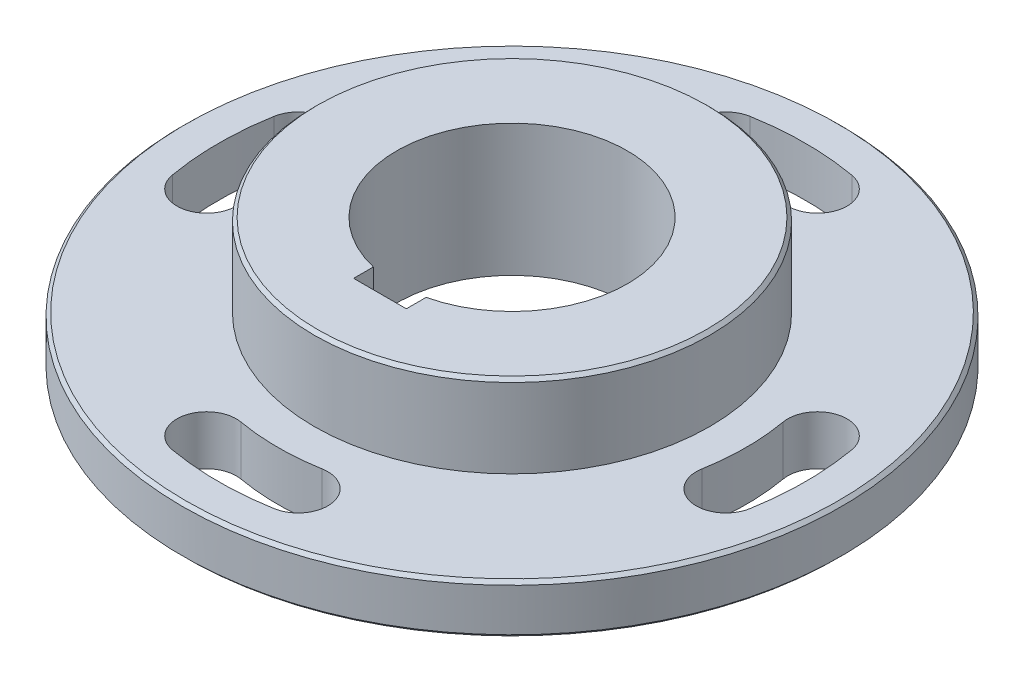
ISO-10303-21;
HEADER;
FILE_DESCRIPTION(('STEP AP214'),'2;1');
FILE_NAME('part.step','',(''),(''),'','','');
FILE_SCHEMA(('AUTOMOTIVE_DESIGN { 1 0 10303 214 1 1 1 1 }'));
ENDSEC;
DATA;
#1=APPLICATION_CONTEXT('core data for automotive mechanical design processes');
#2=APPLICATION_PROTOCOL_DEFINITION('international standard','automotive_design',2000,#1);
#3=PRODUCT_CONTEXT('',#1,'mechanical');
#4=PRODUCT('Part','Part','',(#3));
#5=PRODUCT_RELATED_PRODUCT_CATEGORY('part','',(#4));
#6=PRODUCT_DEFINITION_FORMATION('','',#4);
#7=PRODUCT_DEFINITION_CONTEXT('part definition',#1,'design');
#8=PRODUCT_DEFINITION('design','',#6,#7);
#9=PRODUCT_DEFINITION_SHAPE('','',#8);
#10=(LENGTH_UNIT() NAMED_UNIT(*) SI_UNIT(.MILLI.,.METRE.));
#11=(NAMED_UNIT(*) PLANE_ANGLE_UNIT() SI_UNIT($,.RADIAN.));
#12=(NAMED_UNIT(*) SI_UNIT($,.STERADIAN.) SOLID_ANGLE_UNIT());
#13=UNCERTAINTY_MEASURE_WITH_UNIT(LENGTH_MEASURE(1.E-05),#10,'distance_accuracy_value','');
#14=(GEOMETRIC_REPRESENTATION_CONTEXT(3) GLOBAL_UNCERTAINTY_ASSIGNED_CONTEXT((#13)) GLOBAL_UNIT_ASSIGNED_CONTEXT((#10,
#11,#12)) REPRESENTATION_CONTEXT('',''));
#15=CARTESIAN_POINT('',(0.,0.,0.));
#16=DIRECTION('',(0.,0.,1.));
#17=DIRECTION('',(1.,0.,0.));
#18=AXIS2_PLACEMENT_3D('',#15,#16,#17);
#19=CARTESIAN_POINT('',(35.,0.,0.));
#20=DIRECTION('',(0.,-1.,0.));
#21=DIRECTION('',(0.,0.,-1.));
#22=AXIS2_PLACEMENT_3D('',#19,#20,#21);
#23=PLANE('',#22);
#24=CARTESIAN_POINT('',(0.,0.,0.));
#25=DIRECTION('',(0.,-1.,0.));
#26=DIRECTION('',(0.,0.,-1.));
#27=AXIS2_PLACEMENT_3D('',#24,#25,#26);
#28=CIRCLE('',#27,98.9999999999999);
#29=CARTESIAN_POINT('',(0.,0.,-98.9999999999999));
#30=VERTEX_POINT('',#29);
#31=EDGE_CURVE('E11',#30,#30,#28,.T.);
#32=ORIENTED_EDGE('',*,*,#31,.T.);
#33=EDGE_LOOP('',(#32));
#34=FACE_BOUND('',#33,.T.);
#35=DIRECTION('',(0.,0.,-1.));
#36=VECTOR('',#35,1.);
#37=CARTESIAN_POINT('',(-8.,0.,40.0734500748017));
#38=LINE('',#37,#36);
#39=CARTESIAN_POINT('',(-8.,0.,40.0734500748017));
#40=VERTEX_POINT('',#39);
#41=CARTESIAN_POINT('',(-8.,0.,34.0734500748017));
#42=VERTEX_POINT('',#41);
#43=EDGE_CURVE('E177',#40,#42,#38,.T.);
#44=ORIENTED_EDGE('',*,*,#43,.F.);
#45=DIRECTION('',(-1.,0.,0.));
#46=VECTOR('',#45,1.);
#47=CARTESIAN_POINT('',(-8.,0.,40.0734500748017));
#48=LINE('',#47,#46);
#49=CARTESIAN_POINT('',(8.,0.,40.0734500748017));
#50=VERTEX_POINT('',#49);
#51=EDGE_CURVE('E190',#50,#40,#48,.T.);
#52=ORIENTED_EDGE('',*,*,#51,.F.);
#53=DIRECTION('',(0.,0.,1.));
#54=VECTOR('',#53,1.);
#55=CARTESIAN_POINT('',(8.,0.,40.0734500748017));
#56=LINE('',#55,#54);
#57=CARTESIAN_POINT('',(8.,0.,34.0734500748017));
#58=VERTEX_POINT('',#57);
#59=EDGE_CURVE('E657',#58,#50,#56,.T.);
#60=ORIENTED_EDGE('',*,*,#59,.F.);
#61=CARTESIAN_POINT('',(0.,0.,0.));
#62=DIRECTION('',(0.,-1.,0.));
#63=DIRECTION('',(0.,0.,-1.));
#64=AXIS2_PLACEMENT_3D('',#61,#62,#63);
#65=CIRCLE('',#64,35.);
#66=EDGE_CURVE('E198',#42,#58,#65,.T.);
#67=ORIENTED_EDGE('',*,*,#66,.F.);
#68=EDGE_LOOP('',(#44,#52,#60,#67));
#69=FACE_BOUND('',#68,.T.);
#70=CARTESIAN_POINT('',(13.891854213354,0.,78.7846202409767));
#71=DIRECTION('',(0.,1.,0.));
#72=DIRECTION('',(0.,0.,1.));
#73=AXIS2_PLACEMENT_3D('',#70,#71,#72);
#74=CIRCLE('',#73,9.);
#75=CARTESIAN_POINT('',(15.4546878123562,0.,87.6478900180866));
#76=VERTEX_POINT('',#75);
#77=CARTESIAN_POINT('',(12.3290206143516,0.,69.9213504638669));
#78=VERTEX_POINT('',#77);
#79=EDGE_CURVE('E251',#76,#78,#74,.T.);
#80=ORIENTED_EDGE('',*,*,#79,.T.);
#81=CARTESIAN_POINT('',(0.,0.,0.));
#82=DIRECTION('',(0.,-1.,0.));
#83=DIRECTION('',(0.,0.,1.));
#84=AXIS2_PLACEMENT_3D('',#81,#82,#83);
#85=CIRCLE('',#84,71.);
#86=CARTESIAN_POINT('',(-12.3290206143526,0.,69.9213504638667));
#87=VERTEX_POINT('',#86);
#88=EDGE_CURVE('E303',#78,#87,#85,.T.);
#89=ORIENTED_EDGE('',*,*,#88,.T.);
#90=CARTESIAN_POINT('',(-13.891854213355,0.,78.7846202409766));
#91=DIRECTION('',(0.,1.,0.));
#92=DIRECTION('',(0.,0.,1.));
#93=AXIS2_PLACEMENT_3D('',#90,#91,#92);
#94=CIRCLE('',#93,8.99999999999999);
#95=CARTESIAN_POINT('',(-15.4546878123574,0.,87.6478900180864));
#96=VERTEX_POINT('',#95);
#97=EDGE_CURVE('E306',#87,#96,#94,.T.);
#98=ORIENTED_EDGE('',*,*,#97,.T.);
#99=CARTESIAN_POINT('',(0.,0.,0.));
#100=DIRECTION('',(0.,1.,0.));
#101=DIRECTION('',(0.,0.,1.));
#102=AXIS2_PLACEMENT_3D('',#99,#100,#101);
#103=CIRCLE('',#102,89.);
#104=EDGE_CURVE('E309',#96,#76,#103,.T.);
#105=ORIENTED_EDGE('',*,*,#104,.T.);
#106=EDGE_LOOP('',(#80,#89,#98,#105));
#107=FACE_BOUND('',#106,.T.);
#108=CARTESIAN_POINT('',(-13.8918542133545,0.,-78.7846202409766));
#109=DIRECTION('',(0.,1.,0.));
#110=DIRECTION('',(0.,0.,1.));
#111=AXIS2_PLACEMENT_3D('',#108,#109,#110);
#112=CIRCLE('',#111,9.);
#113=CARTESIAN_POINT('',(-15.4546878123569,0.,-87.6478900180865));
#114=VERTEX_POINT('',#113);
#115=CARTESIAN_POINT('',(-12.3290206143521,0.,-69.9213504638668));
#116=VERTEX_POINT('',#115);
#117=EDGE_CURVE('E257',#114,#116,#112,.T.);
#118=ORIENTED_EDGE('',*,*,#117,.T.);
#119=CARTESIAN_POINT('',(0.,0.,0.));
#120=DIRECTION('',(0.,-1.,0.));
#121=DIRECTION('',(0.,0.,1.));
#122=AXIS2_PLACEMENT_3D('',#119,#120,#121);
#123=CIRCLE('',#122,71.);
#124=CARTESIAN_POINT('',(12.3290206143521,0.,-69.9213504638668));
#125=VERTEX_POINT('',#124);
#126=EDGE_CURVE('E359',#116,#125,#123,.T.);
#127=ORIENTED_EDGE('',*,*,#126,.T.);
#128=CARTESIAN_POINT('',(13.8918542133545,0.,-78.7846202409766));
#129=DIRECTION('',(0.,1.,0.));
#130=DIRECTION('',(0.,0.,1.));
#131=AXIS2_PLACEMENT_3D('',#128,#129,#130);
#132=CIRCLE('',#131,9.);
#133=CARTESIAN_POINT('',(15.4546878123568,0.,-87.6478900180865));
#134=VERTEX_POINT('',#133);
#135=EDGE_CURVE('E362',#125,#134,#132,.T.);
#136=ORIENTED_EDGE('',*,*,#135,.T.);
#137=CARTESIAN_POINT('',(0.,0.,0.));
#138=DIRECTION('',(0.,1.,0.));
#139=DIRECTION('',(0.,0.,1.));
#140=AXIS2_PLACEMENT_3D('',#137,#138,#139);
#141=CIRCLE('',#140,89.);
#142=EDGE_CURVE('E365',#134,#114,#141,.T.);
#143=ORIENTED_EDGE('',*,*,#142,.T.);
#144=EDGE_LOOP('',(#118,#127,#136,#143));
#145=FACE_BOUND('',#144,.T.);
#146=CARTESIAN_POINT('',(-78.7846202409768,0.,13.8918542133537));
#147=DIRECTION('',(0.,1.,0.));
#148=DIRECTION('',(0.,0.,1.));
#149=AXIS2_PLACEMENT_3D('',#146,#147,#148);
#150=CIRCLE('',#149,9.);
#151=CARTESIAN_POINT('',(-87.6478900180867,0.,15.4546878123559));
#152=VERTEX_POINT('',#151);
#153=CARTESIAN_POINT('',(-69.9213504638669,0.,12.3290206143513));
#154=VERTEX_POINT('',#153);
#155=EDGE_CURVE('E263',#152,#154,#150,.T.);
#156=ORIENTED_EDGE('',*,*,#155,.T.);
#157=CARTESIAN_POINT('',(0.,0.,0.));
#158=DIRECTION('',(0.,-1.,0.));
#159=DIRECTION('',(0.,0.,1.));
#160=AXIS2_PLACEMENT_3D('',#157,#158,#159);
#161=CIRCLE('',#160,71.);
#162=CARTESIAN_POINT('',(-69.9213504638666,0.,-12.3290206143529));
#163=VERTEX_POINT('',#162);
#164=EDGE_CURVE('E331',#154,#163,#161,.T.);
#165=ORIENTED_EDGE('',*,*,#164,.T.);
#166=CARTESIAN_POINT('',(-78.7846202409765,0.,-13.8918542133553));
#167=DIRECTION('',(0.,1.,0.));
#168=DIRECTION('',(0.,0.,1.));
#169=AXIS2_PLACEMENT_3D('',#166,#167,#168);
#170=CIRCLE('',#169,8.99999999999999);
#171=CARTESIAN_POINT('',(-87.6478900180864,0.,-15.4546878123578));
#172=VERTEX_POINT('',#171);
#173=EDGE_CURVE('E334',#163,#172,#170,.T.);
#174=ORIENTED_EDGE('',*,*,#173,.T.);
#175=CARTESIAN_POINT('',(0.,0.,0.));
#176=DIRECTION('',(0.,1.,0.));
#177=DIRECTION('',(0.,0.,1.));
#178=AXIS2_PLACEMENT_3D('',#175,#176,#177);
#179=CIRCLE('',#178,89.);
#180=EDGE_CURVE('E337',#172,#152,#179,.T.);
#181=ORIENTED_EDGE('',*,*,#180,.T.);
#182=EDGE_LOOP('',(#156,#165,#174,#181));
#183=FACE_BOUND('',#182,.T.);
#184=CARTESIAN_POINT('',(78.7846202409767,0.,-13.8918542133542));
#185=DIRECTION('',(0.,1.,0.));
#186=DIRECTION('',(0.,0.,1.));
#187=AXIS2_PLACEMENT_3D('',#184,#185,#186);
#188=CIRCLE('',#187,9.);
#189=CARTESIAN_POINT('',(87.6478900180866,0.,-15.4546878123566));
#190=VERTEX_POINT('',#189);
#191=CARTESIAN_POINT('',(69.9213504638668,0.,-12.3290206143519));
#192=VERTEX_POINT('',#191);
#193=EDGE_CURVE('E268',#190,#192,#188,.T.);
#194=ORIENTED_EDGE('',*,*,#193,.T.);
#195=CARTESIAN_POINT('',(0.,0.,0.));
#196=DIRECTION('',(0.,-1.,0.));
#197=DIRECTION('',(0.,0.,1.));
#198=AXIS2_PLACEMENT_3D('',#195,#196,#197);
#199=CIRCLE('',#198,71.);
#200=CARTESIAN_POINT('',(69.9213504638667,0.,12.3290206143523));
#201=VERTEX_POINT('',#200);
#202=EDGE_CURVE('E270',#192,#201,#199,.T.);
#203=ORIENTED_EDGE('',*,*,#202,.T.);
#204=CARTESIAN_POINT('',(78.7846202409766,0.,13.8918542133547));
#205=DIRECTION('',(0.,1.,0.));
#206=DIRECTION('',(0.,0.,1.));
#207=AXIS2_PLACEMENT_3D('',#204,#205,#206);
#208=CIRCLE('',#207,9.);
#209=CARTESIAN_POINT('',(87.6478900180865,0.,15.4546878123572));
#210=VERTEX_POINT('',#209);
#211=EDGE_CURVE('E58',#201,#210,#208,.T.);
#212=ORIENTED_EDGE('',*,*,#211,.T.);
#213=CARTESIAN_POINT('',(0.,0.,0.));
#214=DIRECTION('',(0.,1.,0.));
#215=DIRECTION('',(0.,0.,1.));
#216=AXIS2_PLACEMENT_3D('',#213,#214,#215);
#217=CIRCLE('',#216,89.);
#218=EDGE_CURVE('E272',#210,#190,#217,.T.);
#219=ORIENTED_EDGE('',*,*,#218,.T.);
#220=EDGE_LOOP('',(#194,#203,#212,#219));
#221=FACE_BOUND('',#220,.T.);
#222=ADVANCED_FACE('F35',(#34,#69,#107,#145,#183,#221),#23,.T.);
#223=CARTESIAN_POINT('',(100.,15.,0.));
#224=DIRECTION('',(0.,1.,0.));
#225=DIRECTION('',(0.,0.,1.));
#226=AXIS2_PLACEMENT_3D('',#223,#224,#225);
#227=PLANE('',#226);
#228=CARTESIAN_POINT('',(0.,15.,0.));
#229=DIRECTION('',(0.,1.,0.));
#230=DIRECTION('',(0.,0.,1.));
#231=AXIS2_PLACEMENT_3D('',#228,#229,#230);
#232=CIRCLE('',#231,99.);
#233=CARTESIAN_POINT('',(0.,15.,99.));
#234=VERTEX_POINT('',#233);
#235=EDGE_CURVE('E43',#234,#234,#232,.T.);
#236=ORIENTED_EDGE('',*,*,#235,.T.);
#237=EDGE_LOOP('',(#236));
#238=FACE_BOUND('',#237,.T.);
#239=CARTESIAN_POINT('',(13.891854213354,15.,78.7846202409767));
#240=DIRECTION('',(0.,1.,0.));
#241=DIRECTION('',(0.,0.,1.));
#242=AXIS2_PLACEMENT_3D('',#239,#240,#241);
#243=CIRCLE('',#242,9.);
#244=CARTESIAN_POINT('',(15.4546878123562,15.,87.6478900180866));
#245=VERTEX_POINT('',#244);
#246=CARTESIAN_POINT('',(12.3290206143516,15.,69.9213504638669));
#247=VERTEX_POINT('',#246);
#248=EDGE_CURVE('E312',#245,#247,#243,.T.);
#249=ORIENTED_EDGE('',*,*,#248,.F.);
#250=CARTESIAN_POINT('',(0.,15.,0.));
#251=DIRECTION('',(0.,1.,0.));
#252=DIRECTION('',(0.,0.,1.));
#253=AXIS2_PLACEMENT_3D('',#250,#251,#252);
#254=CIRCLE('',#253,89.);
#255=CARTESIAN_POINT('',(-15.4546878123574,15.,87.6478900180864));
#256=VERTEX_POINT('',#255);
#257=EDGE_CURVE('E304',#256,#245,#254,.T.);
#258=ORIENTED_EDGE('',*,*,#257,.F.);
#259=CARTESIAN_POINT('',(-13.891854213355,15.,78.7846202409766));
#260=DIRECTION('',(0.,1.,0.));
#261=DIRECTION('',(0.,0.,1.));
#262=AXIS2_PLACEMENT_3D('',#259,#260,#261);
#263=CIRCLE('',#262,8.99999999999999);
#264=CARTESIAN_POINT('',(-12.3290206143526,15.,69.9213504638667));
#265=VERTEX_POINT('',#264);
#266=EDGE_CURVE('E318',#265,#256,#263,.T.);
#267=ORIENTED_EDGE('',*,*,#266,.F.);
#268=CARTESIAN_POINT('',(0.,15.,0.));
#269=DIRECTION('',(0.,-1.,0.));
#270=DIRECTION('',(0.,0.,1.));
#271=AXIS2_PLACEMENT_3D('',#268,#269,#270);
#272=CIRCLE('',#271,71.);
#273=EDGE_CURVE('E314',#247,#265,#272,.T.);
#274=ORIENTED_EDGE('',*,*,#273,.F.);
#275=EDGE_LOOP('',(#249,#258,#267,#274));
#276=FACE_BOUND('',#275,.T.);
#277=CARTESIAN_POINT('',(-13.8918542133545,15.,-78.7846202409766));
#278=DIRECTION('',(0.,1.,0.));
#279=DIRECTION('',(0.,0.,1.));
#280=AXIS2_PLACEMENT_3D('',#277,#278,#279);
#281=CIRCLE('',#280,9.);
#282=CARTESIAN_POINT('',(-15.4546878123569,15.,-87.6478900180865));
#283=VERTEX_POINT('',#282);
#284=CARTESIAN_POINT('',(-12.3290206143521,15.,-69.9213504638668));
#285=VERTEX_POINT('',#284);
#286=EDGE_CURVE('E295',#283,#285,#281,.T.);
#287=ORIENTED_EDGE('',*,*,#286,.F.);
#288=CARTESIAN_POINT('',(0.,15.,0.));
#289=DIRECTION('',(0.,1.,0.));
#290=DIRECTION('',(0.,0.,1.));
#291=AXIS2_PLACEMENT_3D('',#288,#289,#290);
#292=CIRCLE('',#291,89.);
#293=CARTESIAN_POINT('',(15.4546878123568,15.,-87.6478900180865));
#294=VERTEX_POINT('',#293);
#295=EDGE_CURVE('E360',#294,#283,#292,.T.);
#296=ORIENTED_EDGE('',*,*,#295,.F.);
#297=CARTESIAN_POINT('',(13.8918542133545,15.,-78.7846202409766));
#298=DIRECTION('',(0.,1.,0.));
#299=DIRECTION('',(0.,0.,1.));
#300=AXIS2_PLACEMENT_3D('',#297,#298,#299);
#301=CIRCLE('',#300,9.);
#302=CARTESIAN_POINT('',(12.3290206143521,15.,-69.9213504638668));
#303=VERTEX_POINT('',#302);
#304=EDGE_CURVE('E371',#303,#294,#301,.T.);
#305=ORIENTED_EDGE('',*,*,#304,.F.);
#306=CARTESIAN_POINT('',(0.,15.,0.));
#307=DIRECTION('',(0.,-1.,0.));
#308=DIRECTION('',(0.,0.,1.));
#309=AXIS2_PLACEMENT_3D('',#306,#307,#308);
#310=CIRCLE('',#309,71.);
#311=EDGE_CURVE('E368',#285,#303,#310,.T.);
#312=ORIENTED_EDGE('',*,*,#311,.F.);
#313=EDGE_LOOP('',(#287,#296,#305,#312));
#314=FACE_BOUND('',#313,.T.);
#315=CARTESIAN_POINT('',(0.,15.,0.));
#316=DIRECTION('',(0.,-1.,0.));
#317=DIRECTION('',(0.,0.,-1.));
#318=AXIS2_PLACEMENT_3D('',#315,#316,#317);
#319=CIRCLE('',#318,60.);
#320=CARTESIAN_POINT('',(0.,15.,-60.));
#321=VERTEX_POINT('',#320);
#322=EDGE_CURVE('E194',#321,#321,#319,.T.);
#323=ORIENTED_EDGE('',*,*,#322,.T.);
#324=EDGE_LOOP('',(#323));
#325=FACE_BOUND('',#324,.T.);
#326=CARTESIAN_POINT('',(-78.7846202409768,15.,13.8918542133537));
#327=DIRECTION('',(0.,1.,0.));
#328=DIRECTION('',(0.,0.,1.));
#329=AXIS2_PLACEMENT_3D('',#326,#327,#328);
#330=CIRCLE('',#329,9.);
#331=CARTESIAN_POINT('',(-87.6478900180867,15.,15.4546878123559));
#332=VERTEX_POINT('',#331);
#333=CARTESIAN_POINT('',(-69.9213504638669,15.,12.3290206143513));
#334=VERTEX_POINT('',#333);
#335=EDGE_CURVE('E340',#332,#334,#330,.T.);
#336=ORIENTED_EDGE('',*,*,#335,.F.);
#337=CARTESIAN_POINT('',(0.,15.,0.));
#338=DIRECTION('',(0.,1.,0.));
#339=DIRECTION('',(0.,0.,1.));
#340=AXIS2_PLACEMENT_3D('',#337,#338,#339);
#341=CIRCLE('',#340,89.);
#342=CARTESIAN_POINT('',(-87.6478900180864,15.,-15.4546878123578));
#343=VERTEX_POINT('',#342);
#344=EDGE_CURVE('E332',#343,#332,#341,.T.);
#345=ORIENTED_EDGE('',*,*,#344,.F.);
#346=CARTESIAN_POINT('',(-78.7846202409765,15.,-13.8918542133553));
#347=DIRECTION('',(0.,1.,0.));
#348=DIRECTION('',(0.,0.,1.));
#349=AXIS2_PLACEMENT_3D('',#346,#347,#348);
#350=CIRCLE('',#349,8.99999999999999);
#351=CARTESIAN_POINT('',(-69.9213504638666,15.,-12.3290206143529));
#352=VERTEX_POINT('',#351);
#353=EDGE_CURVE('E346',#352,#343,#350,.T.);
#354=ORIENTED_EDGE('',*,*,#353,.F.);
#355=CARTESIAN_POINT('',(0.,15.,0.));
#356=DIRECTION('',(0.,-1.,0.));
#357=DIRECTION('',(0.,0.,1.));
#358=AXIS2_PLACEMENT_3D('',#355,#356,#357);
#359=CIRCLE('',#358,71.);
#360=EDGE_CURVE('E342',#334,#352,#359,.T.);
#361=ORIENTED_EDGE('',*,*,#360,.F.);
#362=EDGE_LOOP('',(#336,#345,#354,#361));
#363=FACE_BOUND('',#362,.T.);
#364=CARTESIAN_POINT('',(78.7846202409767,15.,-13.8918542133542));
#365=DIRECTION('',(0.,1.,0.));
#366=DIRECTION('',(0.,0.,1.));
#367=AXIS2_PLACEMENT_3D('',#364,#365,#366);
#368=CIRCLE('',#367,9.);
#369=CARTESIAN_POINT('',(87.6478900180866,15.,-15.4546878123566));
#370=VERTEX_POINT('',#369);
#371=CARTESIAN_POINT('',(69.9213504638668,15.,-12.3290206143519));
#372=VERTEX_POINT('',#371);
#373=EDGE_CURVE('E285',#370,#372,#368,.T.);
#374=ORIENTED_EDGE('',*,*,#373,.F.);
#375=CARTESIAN_POINT('',(0.,15.,0.));
#376=DIRECTION('',(0.,1.,0.));
#377=DIRECTION('',(0.,0.,1.));
#378=AXIS2_PLACEMENT_3D('',#375,#376,#377);
#379=CIRCLE('',#378,89.);
#380=CARTESIAN_POINT('',(87.6478900180865,15.,15.4546878123572));
#381=VERTEX_POINT('',#380);
#382=EDGE_CURVE('E274',#381,#370,#379,.T.);
#383=ORIENTED_EDGE('',*,*,#382,.F.);
#384=CARTESIAN_POINT('',(78.7846202409766,15.,13.8918542133547));
#385=DIRECTION('',(0.,1.,0.));
#386=DIRECTION('',(0.,0.,1.));
#387=AXIS2_PLACEMENT_3D('',#384,#385,#386);
#388=CIRCLE('',#387,9.);
#389=CARTESIAN_POINT('',(69.9213504638667,15.,12.3290206143523));
#390=VERTEX_POINT('',#389);
#391=EDGE_CURVE('E278',#390,#381,#388,.T.);
#392=ORIENTED_EDGE('',*,*,#391,.F.);
#393=CARTESIAN_POINT('',(0.,15.,0.));
#394=DIRECTION('',(0.,-1.,0.));
#395=DIRECTION('',(0.,0.,1.));
#396=AXIS2_PLACEMENT_3D('',#393,#394,#395);
#397=CIRCLE('',#396,71.);
#398=EDGE_CURVE('E287',#372,#390,#397,.T.);
#399=ORIENTED_EDGE('',*,*,#398,.F.);
#400=EDGE_LOOP('',(#374,#383,#392,#399));
#401=FACE_BOUND('',#400,.T.);
#402=ADVANCED_FACE('F221',(#238,#276,#314,#325,#363,#401),#227,.T.);
#403=CARTESIAN_POINT('',(0.,0.,0.));
#404=DIRECTION('',(0.,-1.,0.));
#405=DIRECTION('',(0.,0.,-1.));
#406=AXIS2_PLACEMENT_3D('',#403,#404,#405);
#407=CYLINDRICAL_SURFACE('',#406,35.);
#408=DIRECTION('',(0.,-1.,0.));
#409=VECTOR('',#408,1.);
#410=CARTESIAN_POINT('',(8.,40.,34.0734500748017));
#411=LINE('',#410,#409);
#412=CARTESIAN_POINT('',(8.,40.,34.0734500748017));
#413=VERTEX_POINT('',#412);
#414=EDGE_CURVE('E182',#413,#58,#411,.T.);
#415=ORIENTED_EDGE('',*,*,#414,.F.);
#416=CARTESIAN_POINT('',(0.,40.,0.));
#417=DIRECTION('',(0.,-1.,0.));
#418=DIRECTION('',(0.,0.,-1.));
#419=AXIS2_PLACEMENT_3D('',#416,#417,#418);
#420=CIRCLE('',#419,35.);
#421=CARTESIAN_POINT('',(-8.,40.,34.0734500748017));
#422=VERTEX_POINT('',#421);
#423=EDGE_CURVE('E188',#422,#413,#420,.T.);
#424=ORIENTED_EDGE('',*,*,#423,.F.);
#425=DIRECTION('',(0.,-1.,0.));
#426=VECTOR('',#425,1.);
#427=CARTESIAN_POINT('',(-8.,40.,34.0734500748017));
#428=LINE('',#427,#426);
#429=EDGE_CURVE('E172',#422,#42,#428,.T.);
#430=ORIENTED_EDGE('',*,*,#429,.T.);
#431=ORIENTED_EDGE('',*,*,#66,.T.);
#432=EDGE_LOOP('',(#415,#424,#430,#431));
#433=FACE_BOUND('',#432,.T.);
#434=ADVANCED_FACE('F193',(#433),#407,.F.);
#435=CARTESIAN_POINT('',(0.,0.,0.));
#436=DIRECTION('',(0.,-1.,0.));
#437=DIRECTION('',(0.,0.,-1.));
#438=AXIS2_PLACEMENT_3D('',#435,#436,#437);
#439=CYLINDRICAL_SURFACE('',#438,100.);
#440=CARTESIAN_POINT('',(0.,14.,0.));
#441=DIRECTION('',(0.,1.,0.));
#442=DIRECTION('',(0.,0.,1.));
#443=AXIS2_PLACEMENT_3D('',#440,#441,#442);
#444=CIRCLE('',#443,100.);
#445=CARTESIAN_POINT('',(0.,14.,100.));
#446=VERTEX_POINT('',#445);
#447=EDGE_CURVE('E216',#446,#446,#444,.F.);
#448=ORIENTED_EDGE('',*,*,#447,.T.);
#449=EDGE_LOOP('',(#448));
#450=FACE_BOUND('',#449,.T.);
#451=CARTESIAN_POINT('',(0.,1.00000000000004,0.));
#452=DIRECTION('',(0.,-1.,0.));
#453=DIRECTION('',(0.,0.,-1.));
#454=AXIS2_PLACEMENT_3D('',#451,#452,#453);
#455=CIRCLE('',#454,100.);
#456=CARTESIAN_POINT('',(0.,1.00000000000004,-100.));
#457=VERTEX_POINT('',#456);
#458=EDGE_CURVE('E213',#457,#457,#455,.F.);
#459=ORIENTED_EDGE('',*,*,#458,.T.);
#460=EDGE_LOOP('',(#459));
#461=FACE_BOUND('',#460,.T.);
#462=ADVANCED_FACE('F230',(#450,#461),#439,.T.);
#463=CARTESIAN_POINT('',(0.,0.,0.));
#464=DIRECTION('',(0.,-1.,0.));
#465=DIRECTION('',(0.,0.,-1.));
#466=AXIS2_PLACEMENT_3D('',#463,#464,#465);
#467=CYLINDRICAL_SURFACE('',#466,60.);
#468=CARTESIAN_POINT('',(0.,39.,0.));
#469=DIRECTION('',(0.,1.,0.));
#470=DIRECTION('',(0.,0.,1.));
#471=AXIS2_PLACEMENT_3D('',#468,#469,#470);
#472=CIRCLE('',#471,60.);
#473=CARTESIAN_POINT('',(0.,39.,60.));
#474=VERTEX_POINT('',#473);
#475=EDGE_CURVE('E207',#474,#474,#472,.F.);
#476=ORIENTED_EDGE('',*,*,#475,.T.);
#477=EDGE_LOOP('',(#476));
#478=FACE_BOUND('',#477,.T.);
#479=ORIENTED_EDGE('',*,*,#322,.F.);
#480=EDGE_LOOP('',(#479));
#481=FACE_BOUND('',#480,.T.);
#482=ADVANCED_FACE('F233',(#478,#481),#467,.T.);
#483=CARTESIAN_POINT('',(60.,40.,0.));
#484=DIRECTION('',(0.,1.,0.));
#485=DIRECTION('',(0.,0.,1.));
#486=AXIS2_PLACEMENT_3D('',#483,#484,#485);
#487=PLANE('',#486);
#488=CARTESIAN_POINT('',(0.,40.,0.));
#489=DIRECTION('',(0.,1.,0.));
#490=DIRECTION('',(0.,0.,1.));
#491=AXIS2_PLACEMENT_3D('',#488,#489,#490);
#492=CIRCLE('',#491,59.);
#493=CARTESIAN_POINT('',(0.,40.,59.));
#494=VERTEX_POINT('',#493);
#495=EDGE_CURVE('E210',#494,#494,#492,.T.);
#496=ORIENTED_EDGE('',*,*,#495,.T.);
#497=EDGE_LOOP('',(#496));
#498=FACE_BOUND('',#497,.T.);
#499=DIRECTION('',(0.,0.,-1.));
#500=VECTOR('',#499,1.);
#501=CARTESIAN_POINT('',(-8.,40.,40.0734500748017));
#502=LINE('',#501,#500);
#503=CARTESIAN_POINT('',(-8.,40.,40.0734500748017));
#504=VERTEX_POINT('',#503);
#505=EDGE_CURVE('E175',#504,#422,#502,.T.);
#506=ORIENTED_EDGE('',*,*,#505,.T.);
#507=ORIENTED_EDGE('',*,*,#423,.T.);
#508=DIRECTION('',(0.,0.,1.));
#509=VECTOR('',#508,1.);
#510=CARTESIAN_POINT('',(8.,40.,40.0734500748017));
#511=LINE('',#510,#509);
#512=CARTESIAN_POINT('',(8.,40.,40.0734500748017));
#513=VERTEX_POINT('',#512);
#514=EDGE_CURVE('E189',#413,#513,#511,.T.);
#515=ORIENTED_EDGE('',*,*,#514,.T.);
#516=DIRECTION('',(-1.,0.,0.));
#517=VECTOR('',#516,1.);
#518=CARTESIAN_POINT('',(-8.,40.,40.0734500748017));
#519=LINE('',#518,#517);
#520=EDGE_CURVE('E50',#513,#504,#519,.T.);
#521=ORIENTED_EDGE('',*,*,#520,.T.);
#522=EDGE_LOOP('',(#506,#507,#515,#521));
#523=FACE_BOUND('',#522,.T.);
#524=ADVANCED_FACE('F186',(#498,#523),#487,.T.);
#525=CARTESIAN_POINT('',(-13.8918542133545,0.,-78.7846202409766));
#526=DIRECTION('',(0.,1.,0.));
#527=DIRECTION('',(0.,0.,1.));
#528=AXIS2_PLACEMENT_3D('',#525,#526,#527);
#529=CYLINDRICAL_SURFACE('',#528,9.);
#530=ORIENTED_EDGE('',*,*,#286,.T.);
#531=DIRECTION('',(0.,1.,0.));
#532=VECTOR('',#531,1.);
#533=CARTESIAN_POINT('',(-12.3290206143521,0.,-69.9213504638668));
#534=LINE('',#533,#532);
#535=EDGE_CURVE('E203',#116,#285,#534,.T.);
#536=ORIENTED_EDGE('',*,*,#535,.F.);
#537=ORIENTED_EDGE('',*,*,#117,.F.);
#538=DIRECTION('',(0.,1.,0.));
#539=VECTOR('',#538,1.);
#540=CARTESIAN_POINT('',(-15.4546878123569,0.,-87.6478900180865));
#541=LINE('',#540,#539);
#542=EDGE_CURVE('E195',#114,#283,#541,.T.);
#543=ORIENTED_EDGE('',*,*,#542,.T.);
#544=EDGE_LOOP('',(#530,#536,#537,#543));
#545=FACE_BOUND('',#544,.T.);
#546=ADVANCED_FACE('F394',(#545),#529,.F.);
#547=CARTESIAN_POINT('',(0.,0.,0.));
#548=DIRECTION('',(0.,1.,0.));
#549=DIRECTION('',(0.,0.,1.));
#550=AXIS2_PLACEMENT_3D('',#547,#548,#549);
#551=CYLINDRICAL_SURFACE('',#550,89.);
#552=ORIENTED_EDGE('',*,*,#295,.T.);
#553=ORIENTED_EDGE('',*,*,#542,.F.);
#554=ORIENTED_EDGE('',*,*,#142,.F.);
#555=DIRECTION('',(0.,1.,0.));
#556=VECTOR('',#555,1.);
#557=CARTESIAN_POINT('',(15.4546878123568,0.,-87.6478900180865));
#558=LINE('',#557,#556);
#559=EDGE_CURVE('E200',#134,#294,#558,.T.);
#560=ORIENTED_EDGE('',*,*,#559,.T.);
#561=EDGE_LOOP('',(#552,#553,#554,#560));
#562=FACE_BOUND('',#561,.T.);
#563=ADVANCED_FACE('F393',(#562),#551,.F.);
#564=CARTESIAN_POINT('',(13.8918542133545,0.,-78.7846202409766));
#565=DIRECTION('',(0.,1.,0.));
#566=DIRECTION('',(0.,0.,1.));
#567=AXIS2_PLACEMENT_3D('',#564,#565,#566);
#568=CYLINDRICAL_SURFACE('',#567,9.);
#569=ORIENTED_EDGE('',*,*,#304,.T.);
#570=ORIENTED_EDGE('',*,*,#559,.F.);
#571=ORIENTED_EDGE('',*,*,#135,.F.);
#572=DIRECTION('',(0.,1.,0.));
#573=VECTOR('',#572,1.);
#574=CARTESIAN_POINT('',(12.3290206143521,0.,-69.9213504638668));
#575=LINE('',#574,#573);
#576=EDGE_CURVE('E376',#125,#303,#575,.T.);
#577=ORIENTED_EDGE('',*,*,#576,.T.);
#578=EDGE_LOOP('',(#569,#570,#571,#577));
#579=FACE_BOUND('',#578,.T.);
#580=ADVANCED_FACE('F390',(#579),#568,.F.);
#581=CARTESIAN_POINT('',(0.,0.,0.));
#582=DIRECTION('',(0.,1.,0.));
#583=DIRECTION('',(0.,0.,1.));
#584=AXIS2_PLACEMENT_3D('',#581,#582,#583);
#585=CYLINDRICAL_SURFACE('',#584,71.);
#586=ORIENTED_EDGE('',*,*,#311,.T.);
#587=ORIENTED_EDGE('',*,*,#576,.F.);
#588=ORIENTED_EDGE('',*,*,#126,.F.);
#589=ORIENTED_EDGE('',*,*,#535,.T.);
#590=EDGE_LOOP('',(#586,#587,#588,#589));
#591=FACE_BOUND('',#590,.T.);
#592=ADVANCED_FACE('F383',(#591),#585,.T.);
#593=CARTESIAN_POINT('',(-78.7846202409768,0.,13.8918542133537));
#594=DIRECTION('',(0.,1.,0.));
#595=DIRECTION('',(0.,0.,1.));
#596=AXIS2_PLACEMENT_3D('',#593,#594,#595);
#597=CYLINDRICAL_SURFACE('',#596,9.);
#598=ORIENTED_EDGE('',*,*,#335,.T.);
#599=DIRECTION('',(0.,1.,0.));
#600=VECTOR('',#599,1.);
#601=CARTESIAN_POINT('',(-69.9213504638669,0.,12.3290206143513));
#602=LINE('',#601,#600);
#603=EDGE_CURVE('E339',#154,#334,#602,.T.);
#604=ORIENTED_EDGE('',*,*,#603,.F.);
#605=ORIENTED_EDGE('',*,*,#155,.F.);
#606=DIRECTION('',(0.,1.,0.));
#607=VECTOR('',#606,1.);
#608=CARTESIAN_POINT('',(-87.6478900180867,0.,15.4546878123559));
#609=LINE('',#608,#607);
#610=EDGE_CURVE('E315',#152,#332,#609,.T.);
#611=ORIENTED_EDGE('',*,*,#610,.T.);
#612=EDGE_LOOP('',(#598,#604,#605,#611));
#613=FACE_BOUND('',#612,.T.);
#614=ADVANCED_FACE('F477',(#613),#597,.F.);
#615=CARTESIAN_POINT('',(0.,0.,0.));
#616=DIRECTION('',(0.,1.,0.));
#617=DIRECTION('',(0.,0.,1.));
#618=AXIS2_PLACEMENT_3D('',#615,#616,#617);
#619=CYLINDRICAL_SURFACE('',#618,89.);
#620=ORIENTED_EDGE('',*,*,#344,.T.);
#621=ORIENTED_EDGE('',*,*,#610,.F.);
#622=ORIENTED_EDGE('',*,*,#180,.F.);
#623=DIRECTION('',(0.,1.,0.));
#624=VECTOR('',#623,1.);
#625=CARTESIAN_POINT('',(-87.6478900180864,0.,-15.4546878123578));
#626=LINE('',#625,#624);
#627=EDGE_CURVE('E352',#172,#343,#626,.T.);
#628=ORIENTED_EDGE('',*,*,#627,.T.);
#629=EDGE_LOOP('',(#620,#621,#622,#628));
#630=FACE_BOUND('',#629,.T.);
#631=ADVANCED_FACE('F473',(#630),#619,.F.);
#632=CARTESIAN_POINT('',(-78.7846202409765,0.,-13.8918542133553));
#633=DIRECTION('',(0.,1.,0.));
#634=DIRECTION('',(0.,0.,1.));
#635=AXIS2_PLACEMENT_3D('',#632,#633,#634);
#636=CYLINDRICAL_SURFACE('',#635,8.99999999999999);
#637=ORIENTED_EDGE('',*,*,#353,.T.);
#638=ORIENTED_EDGE('',*,*,#627,.F.);
#639=ORIENTED_EDGE('',*,*,#173,.F.);
#640=DIRECTION('',(0.,1.,0.));
#641=VECTOR('',#640,1.);
#642=CARTESIAN_POINT('',(-69.9213504638666,0.,-12.3290206143529));
#643=LINE('',#642,#641);
#644=EDGE_CURVE('E354',#163,#352,#643,.T.);
#645=ORIENTED_EDGE('',*,*,#644,.T.);
#646=EDGE_LOOP('',(#637,#638,#639,#645));
#647=FACE_BOUND('',#646,.T.);
#648=ADVANCED_FACE('F476',(#647),#636,.F.);
#649=CARTESIAN_POINT('',(0.,0.,0.));
#650=DIRECTION('',(0.,1.,0.));
#651=DIRECTION('',(0.,0.,1.));
#652=AXIS2_PLACEMENT_3D('',#649,#650,#651);
#653=CYLINDRICAL_SURFACE('',#652,71.);
#654=ORIENTED_EDGE('',*,*,#360,.T.);
#655=ORIENTED_EDGE('',*,*,#644,.F.);
#656=ORIENTED_EDGE('',*,*,#164,.F.);
#657=ORIENTED_EDGE('',*,*,#603,.T.);
#658=EDGE_LOOP('',(#654,#655,#656,#657));
#659=FACE_BOUND('',#658,.T.);
#660=ADVANCED_FACE('F471',(#659),#653,.T.);
#661=CARTESIAN_POINT('',(13.891854213354,0.,78.7846202409767));
#662=DIRECTION('',(0.,1.,0.));
#663=DIRECTION('',(0.,0.,1.));
#664=AXIS2_PLACEMENT_3D('',#661,#662,#663);
#665=CYLINDRICAL_SURFACE('',#664,9.);
#666=ORIENTED_EDGE('',*,*,#248,.T.);
#667=DIRECTION('',(0.,1.,0.));
#668=VECTOR('',#667,1.);
#669=CARTESIAN_POINT('',(12.3290206143516,0.,69.9213504638669));
#670=LINE('',#669,#668);
#671=EDGE_CURVE('E311',#78,#247,#670,.T.);
#672=ORIENTED_EDGE('',*,*,#671,.F.);
#673=ORIENTED_EDGE('',*,*,#79,.F.);
#674=DIRECTION('',(0.,1.,0.));
#675=VECTOR('',#674,1.);
#676=CARTESIAN_POINT('',(15.4546878123562,0.,87.6478900180866));
#677=LINE('',#676,#675);
#678=EDGE_CURVE('E288',#76,#245,#677,.T.);
#679=ORIENTED_EDGE('',*,*,#678,.T.);
#680=EDGE_LOOP('',(#666,#672,#673,#679));
#681=FACE_BOUND('',#680,.T.);
#682=ADVANCED_FACE('F461',(#681),#665,.F.);
#683=CARTESIAN_POINT('',(0.,0.,0.));
#684=DIRECTION('',(0.,1.,0.));
#685=DIRECTION('',(0.,0.,1.));
#686=AXIS2_PLACEMENT_3D('',#683,#684,#685);
#687=CYLINDRICAL_SURFACE('',#686,89.);
#688=ORIENTED_EDGE('',*,*,#257,.T.);
#689=ORIENTED_EDGE('',*,*,#678,.F.);
#690=ORIENTED_EDGE('',*,*,#104,.F.);
#691=DIRECTION('',(0.,1.,0.));
#692=VECTOR('',#691,1.);
#693=CARTESIAN_POINT('',(-15.4546878123574,0.,87.6478900180864));
#694=LINE('',#693,#692);
#695=EDGE_CURVE('E324',#96,#256,#694,.T.);
#696=ORIENTED_EDGE('',*,*,#695,.T.);
#697=EDGE_LOOP('',(#688,#689,#690,#696));
#698=FACE_BOUND('',#697,.T.);
#699=ADVANCED_FACE('F457',(#698),#687,.F.);
#700=CARTESIAN_POINT('',(-13.891854213355,0.,78.7846202409766));
#701=DIRECTION('',(0.,1.,0.));
#702=DIRECTION('',(0.,0.,1.));
#703=AXIS2_PLACEMENT_3D('',#700,#701,#702);
#704=CYLINDRICAL_SURFACE('',#703,8.99999999999999);
#705=ORIENTED_EDGE('',*,*,#266,.T.);
#706=ORIENTED_EDGE('',*,*,#695,.F.);
#707=ORIENTED_EDGE('',*,*,#97,.F.);
#708=DIRECTION('',(0.,1.,0.));
#709=VECTOR('',#708,1.);
#710=CARTESIAN_POINT('',(-12.3290206143526,0.,69.9213504638667));
#711=LINE('',#710,#709);
#712=EDGE_CURVE('E326',#87,#265,#711,.T.);
#713=ORIENTED_EDGE('',*,*,#712,.T.);
#714=EDGE_LOOP('',(#705,#706,#707,#713));
#715=FACE_BOUND('',#714,.T.);
#716=ADVANCED_FACE('F460',(#715),#704,.F.);
#717=CARTESIAN_POINT('',(0.,0.,0.));
#718=DIRECTION('',(0.,1.,0.));
#719=DIRECTION('',(0.,0.,1.));
#720=AXIS2_PLACEMENT_3D('',#717,#718,#719);
#721=CYLINDRICAL_SURFACE('',#720,71.);
#722=ORIENTED_EDGE('',*,*,#273,.T.);
#723=ORIENTED_EDGE('',*,*,#712,.F.);
#724=ORIENTED_EDGE('',*,*,#88,.F.);
#725=ORIENTED_EDGE('',*,*,#671,.T.);
#726=EDGE_LOOP('',(#722,#723,#724,#725));
#727=FACE_BOUND('',#726,.T.);
#728=ADVANCED_FACE('F451',(#727),#721,.T.);
#729=CARTESIAN_POINT('',(78.7846202409767,0.,-13.8918542133542));
#730=DIRECTION('',(0.,1.,0.));
#731=DIRECTION('',(0.,0.,1.));
#732=AXIS2_PLACEMENT_3D('',#729,#730,#731);
#733=CYLINDRICAL_SURFACE('',#732,9.);
#734=ORIENTED_EDGE('',*,*,#373,.T.);
#735=DIRECTION('',(0.,1.,0.));
#736=VECTOR('',#735,1.);
#737=CARTESIAN_POINT('',(69.9213504638668,0.,-12.3290206143519));
#738=LINE('',#737,#736);
#739=EDGE_CURVE('E284',#192,#372,#738,.T.);
#740=ORIENTED_EDGE('',*,*,#739,.F.);
#741=ORIENTED_EDGE('',*,*,#193,.F.);
#742=DIRECTION('',(0.,1.,0.));
#743=VECTOR('',#742,1.);
#744=CARTESIAN_POINT('',(87.6478900180866,0.,-15.4546878123566));
#745=LINE('',#744,#743);
#746=EDGE_CURVE('E293',#190,#370,#745,.T.);
#747=ORIENTED_EDGE('',*,*,#746,.T.);
#748=EDGE_LOOP('',(#734,#740,#741,#747));
#749=FACE_BOUND('',#748,.T.);
#750=ADVANCED_FACE('F438',(#749),#733,.F.);
#751=CARTESIAN_POINT('',(0.,0.,0.));
#752=DIRECTION('',(0.,1.,0.));
#753=DIRECTION('',(0.,0.,1.));
#754=AXIS2_PLACEMENT_3D('',#751,#752,#753);
#755=CYLINDRICAL_SURFACE('',#754,89.);
#756=ORIENTED_EDGE('',*,*,#382,.T.);
#757=ORIENTED_EDGE('',*,*,#746,.F.);
#758=ORIENTED_EDGE('',*,*,#218,.F.);
#759=DIRECTION('',(0.,1.,0.));
#760=VECTOR('',#759,1.);
#761=CARTESIAN_POINT('',(87.6478900180865,0.,15.4546878123572));
#762=LINE('',#761,#760);
#763=EDGE_CURVE('E296',#210,#381,#762,.T.);
#764=ORIENTED_EDGE('',*,*,#763,.T.);
#765=EDGE_LOOP('',(#756,#757,#758,#764));
#766=FACE_BOUND('',#765,.T.);
#767=ADVANCED_FACE('F443',(#766),#755,.F.);
#768=CARTESIAN_POINT('',(78.7846202409766,0.,13.8918542133547));
#769=DIRECTION('',(0.,1.,0.));
#770=DIRECTION('',(0.,0.,1.));
#771=AXIS2_PLACEMENT_3D('',#768,#769,#770);
#772=CYLINDRICAL_SURFACE('',#771,9.);
#773=ORIENTED_EDGE('',*,*,#391,.T.);
#774=ORIENTED_EDGE('',*,*,#763,.F.);
#775=ORIENTED_EDGE('',*,*,#211,.F.);
#776=DIRECTION('',(0.,1.,0.));
#777=VECTOR('',#776,1.);
#778=CARTESIAN_POINT('',(69.9213504638667,0.,12.3290206143523));
#779=LINE('',#778,#777);
#780=EDGE_CURVE('E298',#201,#390,#779,.T.);
#781=ORIENTED_EDGE('',*,*,#780,.T.);
#782=EDGE_LOOP('',(#773,#774,#775,#781));
#783=FACE_BOUND('',#782,.T.);
#784=ADVANCED_FACE('F441',(#783),#772,.F.);
#785=CARTESIAN_POINT('',(0.,0.,0.));
#786=DIRECTION('',(0.,1.,0.));
#787=DIRECTION('',(0.,0.,1.));
#788=AXIS2_PLACEMENT_3D('',#785,#786,#787);
#789=CYLINDRICAL_SURFACE('',#788,71.);
#790=ORIENTED_EDGE('',*,*,#398,.T.);
#791=ORIENTED_EDGE('',*,*,#780,.F.);
#792=ORIENTED_EDGE('',*,*,#202,.F.);
#793=ORIENTED_EDGE('',*,*,#739,.T.);
#794=EDGE_LOOP('',(#790,#791,#792,#793));
#795=FACE_BOUND('',#794,.T.);
#796=ADVANCED_FACE('F440',(#795),#789,.T.);
#797=CARTESIAN_POINT('',(-8.,40.,40.0734500748017));
#798=DIRECTION('',(-1.,0.,0.));
#799=DIRECTION('',(0.,0.,1.));
#800=AXIS2_PLACEMENT_3D('',#797,#798,#799);
#801=PLANE('',#800);
#802=ORIENTED_EDGE('',*,*,#43,.T.);
#803=ORIENTED_EDGE('',*,*,#429,.F.);
#804=ORIENTED_EDGE('',*,*,#505,.F.);
#805=DIRECTION('',(0.,-1.,0.));
#806=VECTOR('',#805,1.);
#807=CARTESIAN_POINT('',(-8.,40.,40.0734500748017));
#808=LINE('',#807,#806);
#809=EDGE_CURVE('E343',#504,#40,#808,.T.);
#810=ORIENTED_EDGE('',*,*,#809,.T.);
#811=EDGE_LOOP('',(#802,#803,#804,#810));
#812=FACE_BOUND('',#811,.T.);
#813=ADVANCED_FACE('F174',(#812),#801,.F.);
#814=CARTESIAN_POINT('',(-8.,40.,40.0734500748017));
#815=DIRECTION('',(0.,0.,1.));
#816=DIRECTION('',(1.,0.,0.));
#817=AXIS2_PLACEMENT_3D('',#814,#815,#816);
#818=PLANE('',#817);
#819=ORIENTED_EDGE('',*,*,#51,.T.);
#820=ORIENTED_EDGE('',*,*,#809,.F.);
#821=ORIENTED_EDGE('',*,*,#520,.F.);
#822=DIRECTION('',(0.,-1.,0.));
#823=VECTOR('',#822,1.);
#824=CARTESIAN_POINT('',(8.,40.,40.0734500748017));
#825=LINE('',#824,#823);
#826=EDGE_CURVE('E654',#513,#50,#825,.T.);
#827=ORIENTED_EDGE('',*,*,#826,.T.);
#828=EDGE_LOOP('',(#819,#820,#821,#827));
#829=FACE_BOUND('',#828,.T.);
#830=ADVANCED_FACE('F421',(#829),#818,.F.);
#831=CARTESIAN_POINT('',(8.,40.,40.0734500748017));
#832=DIRECTION('',(1.,0.,0.));
#833=DIRECTION('',(0.,0.,-1.));
#834=AXIS2_PLACEMENT_3D('',#831,#832,#833);
#835=PLANE('',#834);
#836=ORIENTED_EDGE('',*,*,#59,.T.);
#837=ORIENTED_EDGE('',*,*,#826,.F.);
#838=ORIENTED_EDGE('',*,*,#514,.F.);
#839=ORIENTED_EDGE('',*,*,#414,.T.);
#840=EDGE_LOOP('',(#836,#837,#838,#839));
#841=FACE_BOUND('',#840,.T.);
#842=ADVANCED_FACE('F416',(#841),#835,.F.);
#843=CARTESIAN_POINT('',(0.,39.,0.));
#844=DIRECTION('',(0.,-1.,0.));
#845=DIRECTION('',(0.,0.,-1.));
#846=AXIS2_PLACEMENT_3D('',#843,#844,#845);
#847=CONICAL_SURFACE('',#846,60.,0.785398163397441);
#848=ORIENTED_EDGE('',*,*,#495,.F.);
#849=EDGE_LOOP('',(#848));
#850=FACE_BOUND('',#849,.T.);
#851=ORIENTED_EDGE('',*,*,#475,.F.);
#852=EDGE_LOOP('',(#851));
#853=FACE_BOUND('',#852,.T.);
#854=ADVANCED_FACE('F227',(#850,#853),#847,.T.);
#855=CARTESIAN_POINT('',(0.,14.,0.));
#856=DIRECTION('',(0.,-1.,0.));
#857=DIRECTION('',(0.,0.,-1.));
#858=AXIS2_PLACEMENT_3D('',#855,#856,#857);
#859=CONICAL_SURFACE('',#858,100.,0.785398163397448);
#860=ORIENTED_EDGE('',*,*,#235,.F.);
#861=EDGE_LOOP('',(#860));
#862=FACE_BOUND('',#861,.T.);
#863=ORIENTED_EDGE('',*,*,#447,.F.);
#864=EDGE_LOOP('',(#863));
#865=FACE_BOUND('',#864,.T.);
#866=ADVANCED_FACE('F224',(#862,#865),#859,.T.);
#867=CARTESIAN_POINT('',(0.,0.,0.));
#868=DIRECTION('',(0.,1.,0.));
#869=DIRECTION('',(0.,0.,1.));
#870=AXIS2_PLACEMENT_3D('',#867,#868,#869);
#871=CONICAL_SURFACE('',#870,98.9999999999999,0.785398163397469);
#872=ORIENTED_EDGE('',*,*,#458,.F.);
#873=EDGE_LOOP('',(#872));
#874=FACE_BOUND('',#873,.T.);
#875=ORIENTED_EDGE('',*,*,#31,.F.);
#876=EDGE_LOOP('',(#875));
#877=FACE_BOUND('',#876,.T.);
#878=ADVANCED_FACE('F37',(#874,#877),#871,.T.);
#879=CLOSED_SHELL('',(#222,#402,#434,#462,#482,#524,#546,#563,#580,#592,#614,#631,#648,#660,
#682,#699,#716,#728,#750,#767,#784,#796,#813,#830,#842,#854,#866,#878));
#880=MANIFOLD_SOLID_BREP('B2',#879);
#881=ADVANCED_BREP_SHAPE_REPRESENTATION('',(#18,#880),#14);
#882=SHAPE_DEFINITION_REPRESENTATION(#9,#881);
ENDSEC;
END-ISO-10303-21;
